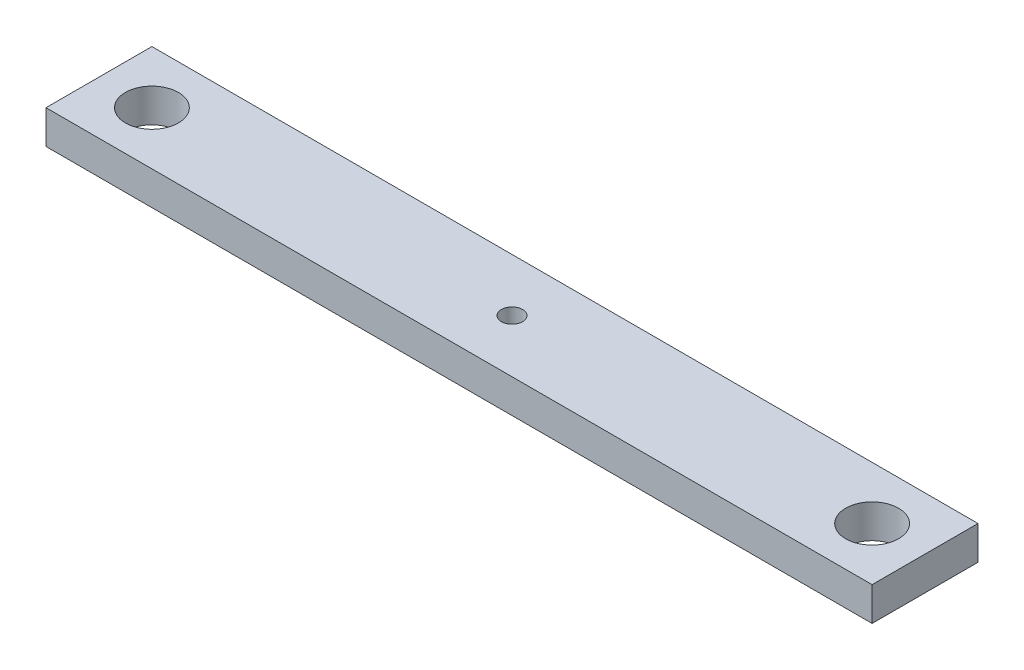
ISO-10303-21;
HEADER;
FILE_DESCRIPTION(('STEP AP214'),'2;1');
FILE_NAME('part.step','',(''),(''),'','','');
FILE_SCHEMA(('AUTOMOTIVE_DESIGN { 1 0 10303 214 1 1 1 1 }'));
ENDSEC;
DATA;
#1=APPLICATION_CONTEXT('core data for automotive mechanical design processes');
#2=APPLICATION_PROTOCOL_DEFINITION('international standard','automotive_design',2000,#1);
#3=PRODUCT_CONTEXT('',#1,'mechanical');
#4=PRODUCT('Part','Part','',(#3));
#5=PRODUCT_RELATED_PRODUCT_CATEGORY('part','',(#4));
#6=PRODUCT_DEFINITION_FORMATION('','',#4);
#7=PRODUCT_DEFINITION_CONTEXT('part definition',#1,'design');
#8=PRODUCT_DEFINITION('design','',#6,#7);
#9=PRODUCT_DEFINITION_SHAPE('','',#8);
#10=(LENGTH_UNIT() NAMED_UNIT(*) SI_UNIT(.MILLI.,.METRE.));
#11=(NAMED_UNIT(*) PLANE_ANGLE_UNIT() SI_UNIT($,.RADIAN.));
#12=(NAMED_UNIT(*) SI_UNIT($,.STERADIAN.) SOLID_ANGLE_UNIT());
#13=UNCERTAINTY_MEASURE_WITH_UNIT(LENGTH_MEASURE(1.E-05),#10,'distance_accuracy_value','');
#14=(GEOMETRIC_REPRESENTATION_CONTEXT(3) GLOBAL_UNCERTAINTY_ASSIGNED_CONTEXT((#13)) GLOBAL_UNIT_ASSIGNED_CONTEXT((#10,
#11,#12)) REPRESENTATION_CONTEXT('',''));
#15=CARTESIAN_POINT('',(0.,0.,0.));
#16=DIRECTION('',(0.,0.,1.));
#17=DIRECTION('',(1.,0.,0.));
#18=AXIS2_PLACEMENT_3D('',#15,#16,#17);
#19=CARTESIAN_POINT('',(39.,3.175,5.));
#20=DIRECTION('',(-1.,0.,0.));
#21=DIRECTION('',(0.,0.,1.));
#22=AXIS2_PLACEMENT_3D('',#19,#20,#21);
#23=PLANE('',#22);
#24=DIRECTION('',(0.,0.,-1.));
#25=VECTOR('',#24,1.);
#26=CARTESIAN_POINT('',(39.,0.,5.));
#27=LINE('',#26,#25);
#28=CARTESIAN_POINT('',(39.,0.,5.));
#29=VERTEX_POINT('',#28);
#30=CARTESIAN_POINT('',(39.,0.,-5.));
#31=VERTEX_POINT('',#30);
#32=EDGE_CURVE('E113',#29,#31,#27,.T.);
#33=ORIENTED_EDGE('',*,*,#32,.T.);
#34=DIRECTION('',(0.,-1.,0.));
#35=VECTOR('',#34,1.);
#36=CARTESIAN_POINT('',(39.,3.175,-5.));
#37=LINE('',#36,#35);
#38=CARTESIAN_POINT('',(39.,3.175,-5.));
#39=VERTEX_POINT('',#38);
#40=EDGE_CURVE('E11',#39,#31,#37,.T.);
#41=ORIENTED_EDGE('',*,*,#40,.F.);
#42=DIRECTION('',(0.,0.,-1.));
#43=VECTOR('',#42,1.);
#44=CARTESIAN_POINT('',(39.,3.175,5.));
#45=LINE('',#44,#43);
#46=CARTESIAN_POINT('',(39.,3.175,5.));
#47=VERTEX_POINT('',#46);
#48=EDGE_CURVE('E97',#47,#39,#45,.T.);
#49=ORIENTED_EDGE('',*,*,#48,.F.);
#50=DIRECTION('',(0.,-1.,0.));
#51=VECTOR('',#50,1.);
#52=CARTESIAN_POINT('',(39.,3.175,5.));
#53=LINE('',#52,#51);
#54=EDGE_CURVE('E109',#47,#29,#53,.T.);
#55=ORIENTED_EDGE('',*,*,#54,.T.);
#56=EDGE_LOOP('',(#33,#41,#49,#55));
#57=FACE_BOUND('',#56,.T.);
#58=ADVANCED_FACE('F45',(#57),#23,.F.);
#59=CARTESIAN_POINT('',(-39.,3.175,-5.));
#60=DIRECTION('',(0.,0.,1.));
#61=DIRECTION('',(1.,0.,0.));
#62=AXIS2_PLACEMENT_3D('',#59,#60,#61);
#63=PLANE('',#62);
#64=DIRECTION('',(-1.,0.,0.));
#65=VECTOR('',#64,1.);
#66=CARTESIAN_POINT('',(-39.,0.,-5.));
#67=LINE('',#66,#65);
#68=CARTESIAN_POINT('',(-39.,0.,-5.));
#69=VERTEX_POINT('',#68);
#70=EDGE_CURVE('E102',#31,#69,#67,.T.);
#71=ORIENTED_EDGE('',*,*,#70,.T.);
#72=DIRECTION('',(0.,-1.,0.));
#73=VECTOR('',#72,1.);
#74=CARTESIAN_POINT('',(-39.,3.175,-5.));
#75=LINE('',#74,#73);
#76=CARTESIAN_POINT('',(-39.,3.175,-5.));
#77=VERTEX_POINT('',#76);
#78=EDGE_CURVE('E54',#77,#69,#75,.T.);
#79=ORIENTED_EDGE('',*,*,#78,.F.);
#80=DIRECTION('',(-1.,0.,0.));
#81=VECTOR('',#80,1.);
#82=CARTESIAN_POINT('',(-39.,3.175,-5.));
#83=LINE('',#82,#81);
#84=EDGE_CURVE('E92',#39,#77,#83,.T.);
#85=ORIENTED_EDGE('',*,*,#84,.F.);
#86=ORIENTED_EDGE('',*,*,#40,.T.);
#87=EDGE_LOOP('',(#71,#79,#85,#86));
#88=FACE_BOUND('',#87,.T.);
#89=ADVANCED_FACE('F101',(#88),#63,.F.);
#90=CARTESIAN_POINT('',(-39.,3.175,5.));
#91=DIRECTION('',(1.,0.,0.));
#92=DIRECTION('',(0.,0.,-1.));
#93=AXIS2_PLACEMENT_3D('',#90,#91,#92);
#94=PLANE('',#93);
#95=DIRECTION('',(0.,0.,1.));
#96=VECTOR('',#95,1.);
#97=CARTESIAN_POINT('',(-39.,0.,5.));
#98=LINE('',#97,#96);
#99=CARTESIAN_POINT('',(-39.,0.,5.));
#100=VERTEX_POINT('',#99);
#101=EDGE_CURVE('E79',#69,#100,#98,.T.);
#102=ORIENTED_EDGE('',*,*,#101,.T.);
#103=DIRECTION('',(0.,-1.,0.));
#104=VECTOR('',#103,1.);
#105=CARTESIAN_POINT('',(-39.,3.175,5.));
#106=LINE('',#105,#104);
#107=CARTESIAN_POINT('',(-39.,3.175,5.));
#108=VERTEX_POINT('',#107);
#109=EDGE_CURVE('E104',#108,#100,#106,.T.);
#110=ORIENTED_EDGE('',*,*,#109,.F.);
#111=DIRECTION('',(0.,0.,1.));
#112=VECTOR('',#111,1.);
#113=CARTESIAN_POINT('',(-39.,3.175,5.));
#114=LINE('',#113,#112);
#115=EDGE_CURVE('E95',#77,#108,#114,.T.);
#116=ORIENTED_EDGE('',*,*,#115,.F.);
#117=ORIENTED_EDGE('',*,*,#78,.T.);
#118=EDGE_LOOP('',(#102,#110,#116,#117));
#119=FACE_BOUND('',#118,.T.);
#120=ADVANCED_FACE('F105',(#119),#94,.F.);
#121=CARTESIAN_POINT('',(-39.,3.175,5.));
#122=DIRECTION('',(0.,0.,-1.));
#123=DIRECTION('',(-1.,0.,0.));
#124=AXIS2_PLACEMENT_3D('',#121,#122,#123);
#125=PLANE('',#124);
#126=DIRECTION('',(1.,0.,0.));
#127=VECTOR('',#126,1.);
#128=CARTESIAN_POINT('',(-39.,0.,5.));
#129=LINE('',#128,#127);
#130=EDGE_CURVE('E85',#100,#29,#129,.T.);
#131=ORIENTED_EDGE('',*,*,#130,.T.);
#132=ORIENTED_EDGE('',*,*,#54,.F.);
#133=DIRECTION('',(1.,0.,0.));
#134=VECTOR('',#133,1.);
#135=CARTESIAN_POINT('',(-39.,3.175,5.));
#136=LINE('',#135,#134);
#137=EDGE_CURVE('E62',#108,#47,#136,.T.);
#138=ORIENTED_EDGE('',*,*,#137,.F.);
#139=ORIENTED_EDGE('',*,*,#109,.T.);
#140=EDGE_LOOP('',(#131,#132,#138,#139));
#141=FACE_BOUND('',#140,.T.);
#142=ADVANCED_FACE('F127',(#141),#125,.F.);
#143=CARTESIAN_POINT('',(0.,3.175,0.));
#144=DIRECTION('',(0.,-1.,0.));
#145=DIRECTION('',(0.,0.,-1.));
#146=AXIS2_PLACEMENT_3D('',#143,#144,#145);
#147=PLANE('',#146);
#148=CARTESIAN_POINT('',(0.,3.175,0.));
#149=DIRECTION('',(0.,1.,0.));
#150=DIRECTION('',(0.,0.,1.));
#151=AXIS2_PLACEMENT_3D('',#148,#149,#150);
#152=CIRCLE('',#151,1.);
#153=CARTESIAN_POINT('',(0.,3.175,1.));
#154=VERTEX_POINT('',#153);
#155=EDGE_CURVE('E143',#154,#154,#152,.T.);
#156=ORIENTED_EDGE('',*,*,#155,.F.);
#157=EDGE_LOOP('',(#156));
#158=FACE_BOUND('',#157,.T.);
#159=CARTESIAN_POINT('',(-34.,3.175,0.));
#160=DIRECTION('',(0.,1.,0.));
#161=DIRECTION('',(0.,0.,1.));
#162=AXIS2_PLACEMENT_3D('',#159,#160,#161);
#163=CIRCLE('',#162,2.5);
#164=CARTESIAN_POINT('',(-34.,3.175,2.5));
#165=VERTEX_POINT('',#164);
#166=EDGE_CURVE('E138',#165,#165,#163,.T.);
#167=ORIENTED_EDGE('',*,*,#166,.F.);
#168=EDGE_LOOP('',(#167));
#169=FACE_BOUND('',#168,.T.);
#170=CARTESIAN_POINT('',(34.,3.175,0.));
#171=DIRECTION('',(0.,1.,0.));
#172=DIRECTION('',(0.,0.,-1.));
#173=AXIS2_PLACEMENT_3D('',#170,#171,#172);
#174=CIRCLE('',#173,2.5);
#175=CARTESIAN_POINT('',(34.,3.175,-2.50000000000001));
#176=VERTEX_POINT('',#175);
#177=EDGE_CURVE('E134',#176,#176,#174,.T.);
#178=ORIENTED_EDGE('',*,*,#177,.F.);
#179=EDGE_LOOP('',(#178));
#180=FACE_BOUND('',#179,.T.);
#181=ORIENTED_EDGE('',*,*,#48,.T.);
#182=ORIENTED_EDGE('',*,*,#84,.T.);
#183=ORIENTED_EDGE('',*,*,#115,.T.);
#184=ORIENTED_EDGE('',*,*,#137,.T.);
#185=EDGE_LOOP('',(#181,#182,#183,#184));
#186=FACE_BOUND('',#185,.T.);
#187=ADVANCED_FACE('F93',(#158,#169,#180,#186),#147,.F.);
#188=CARTESIAN_POINT('',(0.,0.,0.));
#189=DIRECTION('',(0.,-1.,0.));
#190=DIRECTION('',(0.,0.,-1.));
#191=AXIS2_PLACEMENT_3D('',#188,#189,#190);
#192=PLANE('',#191);
#193=CARTESIAN_POINT('',(0.,0.,0.));
#194=DIRECTION('',(0.,-1.,0.));
#195=DIRECTION('',(0.,0.,-1.));
#196=AXIS2_PLACEMENT_3D('',#193,#194,#195);
#197=CIRCLE('',#196,1.);
#198=CARTESIAN_POINT('',(0.,0.,-1.));
#199=VERTEX_POINT('',#198);
#200=EDGE_CURVE('E150',#199,#199,#197,.F.);
#201=ORIENTED_EDGE('',*,*,#200,.T.);
#202=EDGE_LOOP('',(#201));
#203=FACE_BOUND('',#202,.T.);
#204=CARTESIAN_POINT('',(-34.,0.,0.));
#205=DIRECTION('',(0.,-1.,0.));
#206=DIRECTION('',(0.,0.,-1.));
#207=AXIS2_PLACEMENT_3D('',#204,#205,#206);
#208=CIRCLE('',#207,2.5);
#209=CARTESIAN_POINT('',(-34.,0.,-2.5));
#210=VERTEX_POINT('',#209);
#211=EDGE_CURVE('E117',#210,#210,#208,.F.);
#212=ORIENTED_EDGE('',*,*,#211,.T.);
#213=EDGE_LOOP('',(#212));
#214=FACE_BOUND('',#213,.T.);
#215=CARTESIAN_POINT('',(34.,0.,0.));
#216=DIRECTION('',(0.,-1.,0.));
#217=DIRECTION('',(0.,0.,-1.));
#218=AXIS2_PLACEMENT_3D('',#215,#216,#217);
#219=CIRCLE('',#218,2.5);
#220=CARTESIAN_POINT('',(34.,0.,-2.50000000000001));
#221=VERTEX_POINT('',#220);
#222=EDGE_CURVE('E139',#221,#221,#219,.F.);
#223=ORIENTED_EDGE('',*,*,#222,.T.);
#224=EDGE_LOOP('',(#223));
#225=FACE_BOUND('',#224,.T.);
#226=ORIENTED_EDGE('',*,*,#32,.F.);
#227=ORIENTED_EDGE('',*,*,#130,.F.);
#228=ORIENTED_EDGE('',*,*,#101,.F.);
#229=ORIENTED_EDGE('',*,*,#70,.F.);
#230=EDGE_LOOP('',(#226,#227,#228,#229));
#231=FACE_BOUND('',#230,.T.);
#232=ADVANCED_FACE('F130',(#203,#214,#225,#231),#192,.T.);
#233=CARTESIAN_POINT('',(34.,-7.07106781186548,0.));
#234=DIRECTION('',(0.,1.,0.));
#235=DIRECTION('',(0.,0.,1.));
#236=AXIS2_PLACEMENT_3D('',#233,#234,#235);
#237=CYLINDRICAL_SURFACE('',#236,2.5);
#238=ORIENTED_EDGE('',*,*,#177,.T.);
#239=EDGE_LOOP('',(#238));
#240=FACE_BOUND('',#239,.T.);
#241=ORIENTED_EDGE('',*,*,#222,.F.);
#242=EDGE_LOOP('',(#241));
#243=FACE_BOUND('',#242,.T.);
#244=ADVANCED_FACE('F167',(#240,#243),#237,.F.);
#245=CARTESIAN_POINT('',(-34.,-7.07106781186548,0.));
#246=DIRECTION('',(0.,1.,0.));
#247=DIRECTION('',(0.,0.,1.));
#248=AXIS2_PLACEMENT_3D('',#245,#246,#247);
#249=CYLINDRICAL_SURFACE('',#248,2.5);
#250=ORIENTED_EDGE('',*,*,#166,.T.);
#251=EDGE_LOOP('',(#250));
#252=FACE_BOUND('',#251,.T.);
#253=ORIENTED_EDGE('',*,*,#211,.F.);
#254=EDGE_LOOP('',(#253));
#255=FACE_BOUND('',#254,.T.);
#256=ADVANCED_FACE('F170',(#252,#255),#249,.F.);
#257=CARTESIAN_POINT('',(0.,-0.00100000000000013,0.));
#258=DIRECTION('',(0.,1.,0.));
#259=DIRECTION('',(0.,0.,1.));
#260=AXIS2_PLACEMENT_3D('',#257,#258,#259);
#261=CYLINDRICAL_SURFACE('',#260,1.);
#262=ORIENTED_EDGE('',*,*,#200,.F.);
#263=EDGE_LOOP('',(#262));
#264=FACE_BOUND('',#263,.T.);
#265=ORIENTED_EDGE('',*,*,#155,.T.);
#266=EDGE_LOOP('',(#265));
#267=FACE_BOUND('',#266,.T.);
#268=ADVANCED_FACE('F158',(#264,#267),#261,.F.);
#269=CLOSED_SHELL('',(#58,#89,#120,#142,#187,#232,#244,#256,#268));
#270=MANIFOLD_SOLID_BREP('B2',#269);
#271=ADVANCED_BREP_SHAPE_REPRESENTATION('',(#18,#270),#14);
#272=SHAPE_DEFINITION_REPRESENTATION(#9,#271);
ENDSEC;
END-ISO-10303-21;
